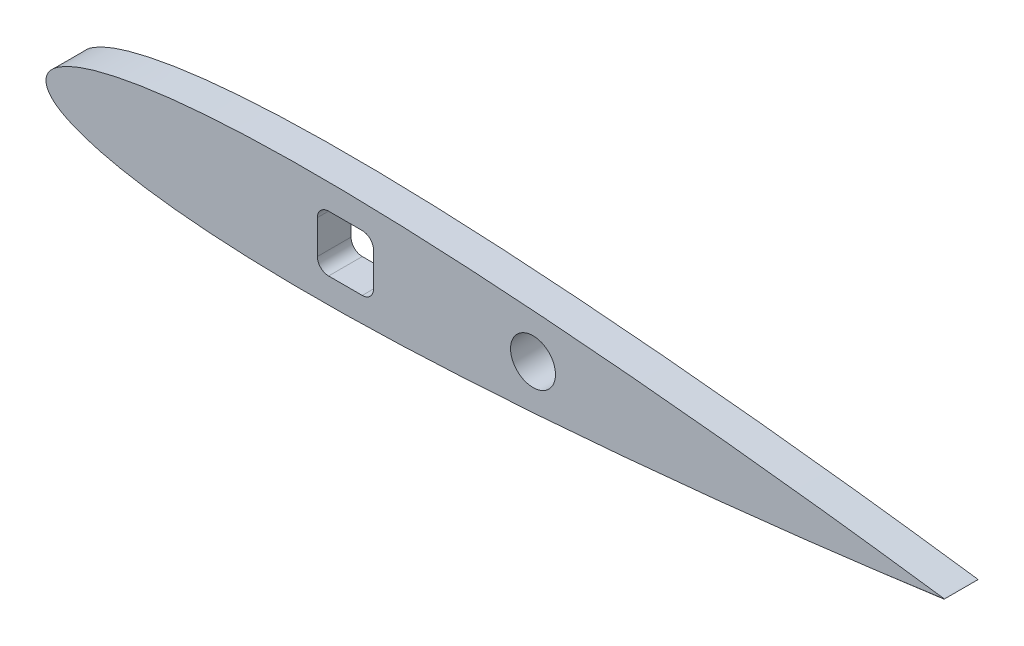
ISO-10303-21;
HEADER;
FILE_DESCRIPTION(('STEP AP214'),'2;1');
FILE_NAME('part.step','',(''),(''),'','','');
FILE_SCHEMA(('AUTOMOTIVE_DESIGN { 1 0 10303 214 1 1 1 1 }'));
ENDSEC;
DATA;
#1=APPLICATION_CONTEXT('core data for automotive mechanical design processes');
#2=APPLICATION_PROTOCOL_DEFINITION('international standard','automotive_design',2000,#1);
#3=PRODUCT_CONTEXT('',#1,'mechanical');
#4=PRODUCT('Part','Part','',(#3));
#5=PRODUCT_RELATED_PRODUCT_CATEGORY('part','',(#4));
#6=PRODUCT_DEFINITION_FORMATION('','',#4);
#7=PRODUCT_DEFINITION_CONTEXT('part definition',#1,'design');
#8=PRODUCT_DEFINITION('design','',#6,#7);
#9=PRODUCT_DEFINITION_SHAPE('','',#8);
#10=(LENGTH_UNIT() NAMED_UNIT(*) SI_UNIT(.MILLI.,.METRE.));
#11=(NAMED_UNIT(*) PLANE_ANGLE_UNIT() SI_UNIT($,.RADIAN.));
#12=(NAMED_UNIT(*) SI_UNIT($,.STERADIAN.) SOLID_ANGLE_UNIT());
#13=UNCERTAINTY_MEASURE_WITH_UNIT(LENGTH_MEASURE(1.E-05),#10,'distance_accuracy_value','');
#14=(GEOMETRIC_REPRESENTATION_CONTEXT(3) GLOBAL_UNCERTAINTY_ASSIGNED_CONTEXT((#13)) GLOBAL_UNIT_ASSIGNED_CONTEXT((#10,
#11,#12)) REPRESENTATION_CONTEXT('',''));
#15=CARTESIAN_POINT('',(0.,0.,0.));
#16=DIRECTION('',(0.,0.,1.));
#17=DIRECTION('',(1.,0.,0.));
#18=AXIS2_PLACEMENT_3D('',#15,#16,#17);
#19=CARTESIAN_POINT('',(0.,0.,6.));
#20=DIRECTION('',(0.,0.,-1.));
#21=DIRECTION('',(-1.,0.,0.));
#22=AXIS2_PLACEMENT_3D('',#19,#20,#21);
#23=PLANE('',#22);
#24=CARTESIAN_POINT('',(86.7452339874848,0.,6.));
#25=DIRECTION('',(0.,0.,-1.));
#26=DIRECTION('',(-1.,0.,0.));
#27=AXIS2_PLACEMENT_3D('',#24,#25,#26);
#28=CIRCLE('',#27,4.00000000000001);
#29=CARTESIAN_POINT('',(82.7452339874848,0.,6.));
#30=VERTEX_POINT('',#29);
#31=EDGE_CURVE('E174',#30,#30,#28,.F.);
#32=ORIENTED_EDGE('',*,*,#31,.F.);
#33=EDGE_LOOP('',(#32));
#34=FACE_BOUND('',#33,.T.);
#35=CARTESIAN_POINT('',(160.,0.,6.));
#36=CARTESIAN_POINT('',(160.,0.0665913442895197,6.));
#37=CARTESIAN_POINT('',(159.008486514791,0.137516412902894,6.));
#38=CARTESIAN_POINT('',(158.424403869658,0.221471317281854,6.));
#39=CARTESIAN_POINT('',(158.144338748107,0.260261487703407,6.));
#40=CARTESIAN_POINT('',(157.684388421284,0.324769540754314,6.));
#41=CARTESIAN_POINT('',(157.039126305256,0.414505738228109,6.));
#42=CARTESIAN_POINT('',(156.213186240448,0.528445908827639,6.));
#43=CARTESIAN_POINT('',(155.207288701819,0.666731734269179,6.));
#44=CARTESIAN_POINT('',(154.024156073932,0.827867529907235,6.));
#45=CARTESIAN_POINT('',(152.666421822384,1.01080968752747,6.));
#46=CARTESIAN_POINT('',(151.137358571736,1.21477584449611,6.));
#47=CARTESIAN_POINT('',(149.44050163396,1.43830165736286,6.));
#48=CARTESIAN_POINT('',(147.579810673162,1.68033718653117,6.));
#49=CARTESIAN_POINT('',(145.559591027277,1.93893961563404,6.));
#50=CARTESIAN_POINT('',(143.384594100147,2.21345495844956,6.));
#51=CARTESIAN_POINT('',(141.059883390887,2.50196263274632,6.));
#52=CARTESIAN_POINT('',(138.59090957664,2.80297044173146,6.));
#53=CARTESIAN_POINT('',(135.98345714493,3.1151347586705,6.));
#54=CARTESIAN_POINT('',(133.243598366923,3.43682445150593,6.));
#55=CARTESIAN_POINT('',(130.377631627294,3.76611244694073,6.));
#56=CARTESIAN_POINT('',(127.392413595854,4.1021577960061,6.));
#57=CARTESIAN_POINT('',(124.294822673243,4.442549864619,6.));
#58=CARTESIAN_POINT('',(121.092191643768,4.78637444268676,6.));
#59=CARTESIAN_POINT('',(117.79187495348,5.13117448589936,6.));
#60=CARTESIAN_POINT('',(114.401652067363,5.47631105428912,6.));
#61=CARTESIAN_POINT('',(110.929399347521,5.81912272354362,6.));
#62=CARTESIAN_POINT('',(107.383281015951,6.15853286209949,6.));
#63=CARTESIAN_POINT('',(103.771531837849,6.49218407854009,6.));
#64=CARTESIAN_POINT('',(100.102577127609,6.81898555162735,6.));
#65=CARTESIAN_POINT('',(96.3850083478131,7.13623567074972,6.));
#66=CARTESIAN_POINT('',(92.6274889078264,7.44251539830241,6.));
#67=CARTESIAN_POINT('',(88.8388421597274,7.7358687859615,6.));
#68=CARTESIAN_POINT('',(85.0278683182967,8.01394094022274,6.));
#69=CARTESIAN_POINT('',(81.2035233400238,8.27498781962035,6.));
#70=CARTESIAN_POINT('',(77.374734607742,8.5169242233947,6.));
#71=CARTESIAN_POINT('',(73.5503645677041,8.73741361137656,6.));
#72=CARTESIAN_POINT('',(69.7394161015396,8.93471234205793,6.));
#73=CARTESIAN_POINT('',(65.9507028394714,9.10666647682192,6.));
#74=CARTESIAN_POINT('',(62.193104455473,9.25136047024652,6.));
#75=CARTESIAN_POINT('',(58.4754531383157,9.36718794509563,6.));
#76=CARTESIAN_POINT('',(54.8064043694087,9.45208857908382,6.));
#77=CARTESIAN_POINT('',(51.1945238394339,9.50456565575243,6.));
#78=CARTESIAN_POINT('',(47.6481593413689,9.52314422677756,6.));
#79=CARTESIAN_POINT('',(44.175663124623,9.50672032249388,6.));
#80=CARTESIAN_POINT('',(40.7851621334313,9.45455551468586,6.));
#81=CARTESIAN_POINT('',(37.4846013989252,9.36507333404973,6.));
#82=CARTESIAN_POINT('',(34.2816159492803,9.23866975749507,6.));
#83=CARTESIAN_POINT('',(31.1836795301445,9.07443654200926,6.));
#84=CARTESIAN_POINT('',(28.198004535038,8.87283401452577,6.));
#85=CARTESIAN_POINT('',(25.3316215482667,8.63390420748747,6.));
#86=CARTESIAN_POINT('',(22.5911947435377,8.35808138151879,6.));
#87=CARTESIAN_POINT('',(19.9830915883747,8.04641185873972,6.));
#88=CARTESIAN_POINT('',(17.5133247824467,7.70016249229624,6.));
#89=CARTESIAN_POINT('',(15.1877125079851,7.31997871948299,6.));
#90=CARTESIAN_POINT('',(13.0115846299075,6.90776063527251,6.));
#91=CARTESIAN_POINT('',(10.9899494711047,6.46505824405837,6.));
#92=CARTESIAN_POINT('',(9.12753175584421,5.99337226158181,6.));
#93=CARTESIAN_POINT('',(7.42844684828317,5.49481576057669,6.));
#94=CARTESIAN_POINT('',(5.89644122559384,4.9710444516897,6.));
#95=CARTESIAN_POINT('',(4.53478197605033,4.42386731692672,6.));
#96=CARTESIAN_POINT('',(3.3461645646699,3.85486286594481,6.));
#97=CARTESIAN_POINT('',(2.33285346312171,3.26521573517184,6.));
#98=CARTESIAN_POINT('',(1.49602863104264,2.65592549182274,6.));
#99=CARTESIAN_POINT('',(0.837307039001217,2.02598988997875,6.));
#100=CARTESIAN_POINT('',(0.358277212466066,1.37362442576094,6.));
#101=CARTESIAN_POINT('',(0.0653976228021366,0.69564041214513,6.));
#102=CARTESIAN_POINT('',(-0.0318775396974388,0.,6.));
#103=CARTESIAN_POINT('',(0.0653976228021371,-0.695640412145142,6.));
#104=CARTESIAN_POINT('',(0.358277212466079,-1.37362442576096,6.));
#105=CARTESIAN_POINT('',(0.837307039001192,-2.02598988997872,6.));
#106=CARTESIAN_POINT('',(1.49602863104265,-2.65592549182275,6.));
#107=CARTESIAN_POINT('',(2.3328534631217,-3.26521573517183,6.));
#108=CARTESIAN_POINT('',(3.34616456466993,-3.85486286594482,6.));
#109=CARTESIAN_POINT('',(4.53478197605032,-4.42386731692672,6.));
#110=CARTESIAN_POINT('',(5.89644122559384,-4.9710444516897,6.));
#111=CARTESIAN_POINT('',(7.42844684828316,-5.49481576057669,6.));
#112=CARTESIAN_POINT('',(9.12753175584424,-5.99337226158182,6.));
#113=CARTESIAN_POINT('',(10.9899494711047,-6.46505824405836,6.));
#114=CARTESIAN_POINT('',(13.0115846299075,-6.90776063527252,6.));
#115=CARTESIAN_POINT('',(15.187712507985,-7.31997871948299,6.));
#116=CARTESIAN_POINT('',(17.5133247824466,-7.70016249229623,6.));
#117=CARTESIAN_POINT('',(19.9830915883747,-8.04641185873973,6.));
#118=CARTESIAN_POINT('',(22.5911947435377,-8.35808138151878,6.));
#119=CARTESIAN_POINT('',(25.3316215482666,-8.63390420748747,6.));
#120=CARTESIAN_POINT('',(28.198004535038,-8.87283401452577,6.));
#121=CARTESIAN_POINT('',(31.1836795301445,-9.07443654200926,6.));
#122=CARTESIAN_POINT('',(34.2816159492803,-9.23866975749507,6.));
#123=CARTESIAN_POINT('',(37.4846013989252,-9.36507333404972,6.));
#124=CARTESIAN_POINT('',(40.7851621334314,-9.45455551468586,6.));
#125=CARTESIAN_POINT('',(44.175663124623,-9.50672032249388,6.));
#126=CARTESIAN_POINT('',(47.6481593413688,-9.52314422677756,6.));
#127=CARTESIAN_POINT('',(51.1945238394339,-9.50456565575243,6.));
#128=CARTESIAN_POINT('',(54.8064043694087,-9.45208857908381,6.));
#129=CARTESIAN_POINT('',(58.4754531383157,-9.36718794509563,6.));
#130=CARTESIAN_POINT('',(62.193104455473,-9.25136047024653,6.));
#131=CARTESIAN_POINT('',(65.9507028394714,-9.10666647682192,6.));
#132=CARTESIAN_POINT('',(69.7394161015397,-8.93471234205793,6.));
#133=CARTESIAN_POINT('',(73.5503645677041,-8.73741361137656,6.));
#134=CARTESIAN_POINT('',(77.3747346077421,-8.5169242233947,6.));
#135=CARTESIAN_POINT('',(81.2035233400238,-8.27498781962035,6.));
#136=CARTESIAN_POINT('',(85.0278683182967,-8.01394094022274,6.));
#137=CARTESIAN_POINT('',(88.8388421597274,-7.7358687859615,6.));
#138=CARTESIAN_POINT('',(92.6274889078264,-7.44251539830241,6.));
#139=CARTESIAN_POINT('',(96.3850083478131,-7.13623567074973,6.));
#140=CARTESIAN_POINT('',(100.10257712761,-6.81898555162735,6.));
#141=CARTESIAN_POINT('',(103.771531837849,-6.49218407854009,6.));
#142=CARTESIAN_POINT('',(107.383281015951,-6.15853286209949,6.));
#143=CARTESIAN_POINT('',(110.929399347521,-5.81912272354363,6.));
#144=CARTESIAN_POINT('',(114.401652067363,-5.47631105428912,6.));
#145=CARTESIAN_POINT('',(117.79187495348,-5.13117448589935,6.));
#146=CARTESIAN_POINT('',(121.092191643768,-4.78637444268676,6.));
#147=CARTESIAN_POINT('',(124.294822673243,-4.442549864619,6.));
#148=CARTESIAN_POINT('',(127.392413595854,-4.1021577960061,6.));
#149=CARTESIAN_POINT('',(130.377631627294,-3.76611244694073,6.));
#150=CARTESIAN_POINT('',(133.243598366923,-3.43682445150593,6.));
#151=CARTESIAN_POINT('',(135.98345714493,-3.1151347586705,6.));
#152=CARTESIAN_POINT('',(138.59090957664,-2.80297044173146,6.));
#153=CARTESIAN_POINT('',(141.059883390887,-2.50196263274633,6.));
#154=CARTESIAN_POINT('',(143.384594100147,-2.21345495844956,6.));
#155=CARTESIAN_POINT('',(145.559591027277,-1.93893961563404,6.));
#156=CARTESIAN_POINT('',(147.579810673162,-1.68033718653117,6.));
#157=CARTESIAN_POINT('',(149.44050163396,-1.43830165736286,6.));
#158=CARTESIAN_POINT('',(151.137358571736,-1.21477584449612,6.));
#159=CARTESIAN_POINT('',(152.666421822384,-1.01080968752747,6.));
#160=CARTESIAN_POINT('',(154.024156073932,-0.827867529907234,6.));
#161=CARTESIAN_POINT('',(155.207288701819,-0.666731734269179,6.));
#162=CARTESIAN_POINT('',(156.213186240449,-0.528445908827641,6.));
#163=CARTESIAN_POINT('',(157.039126305256,-0.414505738228109,6.));
#164=CARTESIAN_POINT('',(157.684388421284,-0.324769540754311,6.));
#165=CARTESIAN_POINT('',(158.144338748106,-0.26026148770341,6.));
#166=CARTESIAN_POINT('',(158.424403869658,-0.221471317281851,6.));
#167=CARTESIAN_POINT('',(159.008486514791,-0.137516412902905,6.));
#168=CARTESIAN_POINT('',(160.,-0.0665913442895195,6.));
#169=CARTESIAN_POINT('',(160.,0.,6.));
#170=B_SPLINE_CURVE_WITH_KNOTS('',3,(#35,#36,#37,#38,#39,#40,#41,#42,#43,#44,#45,#46,#47,#48,
#49,#50,#51,#52,#53,#54,#55,#56,#57,#58,#59,#60,#61,#62,#63,#64,#65,#66,#67,#68,#69,#70,#71,#72,
#73,#74,#75,#76,#77,#78,#79,#80,#81,#82,#83,#84,#85,#86,#87,#88,#89,#90,#91,#92,#93,#94,#95,#96,
#97,#98,#99,#100,#101,#102,#103,#104,#105,#106,#107,#108,#109,#110,#111,#112,#113,#114,#115,
#116,#117,#118,#119,#120,#121,#122,#123,#124,#125,#126,#127,#128,#129,#130,#131,#132,#133,#134,
#135,#136,#137,#138,#139,#140,#141,#142,#143,#144,#145,#146,#147,#148,#149,#150,#151,#152,#153,
#154,#155,#156,#157,#158,#159,#160,#161,#162,#163,#164,#165,#166,#167,#168,#169),.UNSPECIFIED.,
.T.,.F.,(4,1,1,1,1,1,1,1,1,1,1,1,1,1,1,1,1,1,1,1,1,1,1,1,1,1,1,1,1,1,1,1,1,1,1,1,1,1,1,1,1,1,1,
1,1,1,1,1,1,1,1,1,1,1,1,1,1,1,1,1,1,1,1,1,1,1,1,1,1,1,1,1,1,1,1,1,1,1,1,1,1,1,1,1,1,1,1,1,1,1,1,
1,1,1,1,1,1,1,1,1,1,1,1,1,1,1,1,1,1,1,1,1,1,1,1,1,1,1,1,1,1,1,1,1,1,1,1,1,1,1,1,1,4),(0.,
0.00440467877607202,0.0046913326010446,0.00555026340376534,0.00697995981519019,
0.00897636955575151,0.0115348259983267,0.0146494199721657,0.0183124683189223,0.0225153296324683,
0.027247506970764,0.0324978970649823,0.0382539577930807,0.0445020671937163,0.0512268693128557,
0.0584133135428292,0.0660434673993255,0.0740989843347142,0.0825619521789472,0.0914115186687871,
0.100627009155856,0.110186574776246,0.120067575035648,0.130246743106007,0.14070054643734,
0.151404252343734,0.162331841997186,0.173458675482624,0.184758289929072,0.196204075961195,
0.207768617593539,0.219425944952416,0.231147635032322,0.242906359321633,0.254675296387103,
0.266426209651708,0.278132454896869,0.289766476741438,0.301301813942273,0.312711645898873,
0.323969258941208,0.335050049671032,0.345928598532134,0.356580621276815,0.366981996114759,
0.377109775978293,0.386942118775621,0.39645790501707,0.405636644881027,0.414459070100142,
0.422906620434811,0.430962851259574,0.438611617879912,0.445838275003431,0.452630376831667,
0.458976172588127,0.464866300152943,0.47029386795868,0.475254828842886,0.479749124231555,
0.483781005917053,0.487362579763519,0.490515631725567,0.493278565846157,0.495712194393142,
0.497909944007276,0.5,0.502090055992724,0.504287805606858,0.506721434153843,0.509484368274433,
0.512637420236481,0.516218994082947,0.520250875768445,0.524745171157114,0.52970613204132,
0.535133699847057,0.541023827411873,0.547369623168333,0.554161724996569,0.561388382120088,
0.569037148740426,0.577093379565189,0.585540929899858,0.594363355118973,0.60354209498293,
0.613057881224379,0.622890224021707,0.633018003885241,0.643419378723185,0.654071401467866,
0.664949950328968,0.676030741058791,0.687288354101127,0.698698186057727,0.710233523258562,
0.721867545103131,0.733573790348292,0.745324703612897,0.757093640678367,0.768852364967678,
0.780574055047584,0.792231382406461,0.803795924038805,0.815241710070928,0.826541324517376,
0.837668158002814,0.848595747656266,0.85929945356266,0.869753256893993,0.879932424964352,
0.889813425223754,0.899372990844144,0.908588481331213,0.917438047821053,0.925901015665286,
0.933956532600675,0.941586686457171,0.948773130687145,0.955497932806284,0.96174604220692,
0.967502102935018,0.972752493029236,0.977484670367532,0.981687531681078,0.985350580027834,
0.988465174001673,0.991023630444249,0.99302004018481,0.994449736596235,0.995308667398955,
0.995595321223928,1.),.UNSPECIFIED.);
#171=CARTESIAN_POINT('',(160.,0.,6.));
#172=VERTEX_POINT('',#171);
#173=EDGE_CURVE('E11',#172,#172,#170,.T.);
#174=ORIENTED_EDGE('',*,*,#173,.T.);
#175=EDGE_LOOP('',(#174));
#176=FACE_BOUND('',#175,.T.);
#177=CARTESIAN_POINT('',(56.33333333,-3.00000000000001,6.));
#178=DIRECTION('',(0.,0.,1.));
#179=DIRECTION('',(1.,0.,0.));
#180=AXIS2_PLACEMENT_3D('',#177,#178,#179);
#181=CIRCLE('',#180,2.);
#182=CARTESIAN_POINT('',(56.33333333,-5.00000000000001,6.));
#183=VERTEX_POINT('',#182);
#184=CARTESIAN_POINT('',(58.33333333,-3.00000000000001,6.));
#185=VERTEX_POINT('',#184);
#186=EDGE_CURVE('E220',#183,#185,#181,.T.);
#187=ORIENTED_EDGE('',*,*,#186,.F.);
#188=DIRECTION('',(-1.,0.,0.));
#189=VECTOR('',#188,1.);
#190=CARTESIAN_POINT('',(56.33333333,-5.00000000000001,6.));
#191=LINE('',#190,#189);
#192=CARTESIAN_POINT('',(50.33333333,-5.00000000000001,6.));
#193=VERTEX_POINT('',#192);
#194=EDGE_CURVE('E235',#183,#193,#191,.T.);
#195=ORIENTED_EDGE('',*,*,#194,.T.);
#196=CARTESIAN_POINT('',(50.33333333,-3.00000000000001,6.));
#197=DIRECTION('',(0.,0.,-1.));
#198=DIRECTION('',(-1.,0.,0.));
#199=AXIS2_PLACEMENT_3D('',#196,#197,#198);
#200=CIRCLE('',#199,2.);
#201=CARTESIAN_POINT('',(48.33333333,-3.00000000000001,6.));
#202=VERTEX_POINT('',#201);
#203=EDGE_CURVE('E58',#193,#202,#200,.T.);
#204=ORIENTED_EDGE('',*,*,#203,.T.);
#205=DIRECTION('',(0.,1.,0.));
#206=VECTOR('',#205,1.);
#207=CARTESIAN_POINT('',(48.33333333,-3.00000000000001,6.));
#208=LINE('',#207,#206);
#209=CARTESIAN_POINT('',(48.33333333,2.99999999999999,6.));
#210=VERTEX_POINT('',#209);
#211=EDGE_CURVE('E231',#202,#210,#208,.T.);
#212=ORIENTED_EDGE('',*,*,#211,.T.);
#213=CARTESIAN_POINT('',(50.33333333,2.99999999999999,6.));
#214=DIRECTION('',(0.,0.,1.));
#215=DIRECTION('',(1.,0.,0.));
#216=AXIS2_PLACEMENT_3D('',#213,#214,#215);
#217=CIRCLE('',#216,2.);
#218=CARTESIAN_POINT('',(50.33333333,4.99999999999999,6.));
#219=VERTEX_POINT('',#218);
#220=EDGE_CURVE('E229',#219,#210,#217,.T.);
#221=ORIENTED_EDGE('',*,*,#220,.F.);
#222=DIRECTION('',(-1.,0.,0.));
#223=VECTOR('',#222,1.);
#224=CARTESIAN_POINT('',(56.33333333,4.99999999999999,6.));
#225=LINE('',#224,#223);
#226=CARTESIAN_POINT('',(56.33333333,4.99999999999999,6.));
#227=VERTEX_POINT('',#226);
#228=EDGE_CURVE('E227',#227,#219,#225,.T.);
#229=ORIENTED_EDGE('',*,*,#228,.F.);
#230=CARTESIAN_POINT('',(56.33333333,2.99999999999999,6.));
#231=DIRECTION('',(0.,0.,1.));
#232=DIRECTION('',(1.,0.,0.));
#233=AXIS2_PLACEMENT_3D('',#230,#231,#232);
#234=CIRCLE('',#233,2.);
#235=CARTESIAN_POINT('',(58.33333333,2.99999999999999,6.));
#236=VERTEX_POINT('',#235);
#237=EDGE_CURVE('E225',#236,#227,#234,.T.);
#238=ORIENTED_EDGE('',*,*,#237,.F.);
#239=DIRECTION('',(0.,1.,0.));
#240=VECTOR('',#239,1.);
#241=CARTESIAN_POINT('',(58.33333333,-3.00000000000001,6.));
#242=LINE('',#241,#240);
#243=EDGE_CURVE('E222',#185,#236,#242,.T.);
#244=ORIENTED_EDGE('',*,*,#243,.F.);
#245=EDGE_LOOP('',(#187,#195,#204,#212,#221,#229,#238,#244));
#246=FACE_BOUND('',#245,.T.);
#247=ADVANCED_FACE('F33',(#34,#176,#246),#23,.F.);
#248=CARTESIAN_POINT('',(0.,0.,0.));
#249=DIRECTION('',(0.,0.,-1.));
#250=DIRECTION('',(-1.,0.,0.));
#251=AXIS2_PLACEMENT_3D('',#248,#249,#250);
#252=PLANE('',#251);
#253=CARTESIAN_POINT('',(86.7452339874848,0.,0.));
#254=DIRECTION('',(0.,0.,1.));
#255=DIRECTION('',(1.,0.,0.));
#256=AXIS2_PLACEMENT_3D('',#253,#254,#255);
#257=CIRCLE('',#256,4.00000000000001);
#258=CARTESIAN_POINT('',(90.7452339874848,0.,0.));
#259=VERTEX_POINT('',#258);
#260=EDGE_CURVE('E482',#259,#259,#257,.T.);
#261=ORIENTED_EDGE('',*,*,#260,.T.);
#262=EDGE_LOOP('',(#261));
#263=FACE_BOUND('',#262,.T.);
#264=CARTESIAN_POINT('',(13.,-2.,0.));
#265=DIRECTION('',(0.,0.,-1.));
#266=DIRECTION('',(-1.,0.,0.));
#267=AXIS2_PLACEMENT_3D('',#264,#265,#266);
#268=CIRCLE('',#267,2.);
#269=CARTESIAN_POINT('',(13.,-4.,0.));
#270=VERTEX_POINT('',#269);
#271=CARTESIAN_POINT('',(11.,-1.99999999999999,0.));
#272=VERTEX_POINT('',#271);
#273=EDGE_CURVE('E50',#270,#272,#268,.T.);
#274=ORIENTED_EDGE('',*,*,#273,.F.);
#275=DIRECTION('',(1.,0.,0.));
#276=VECTOR('',#275,1.);
#277=CARTESIAN_POINT('',(13.,-4.,0.));
#278=LINE('',#277,#276);
#279=CARTESIAN_POINT('',(17.,-4.,0.));
#280=VERTEX_POINT('',#279);
#281=EDGE_CURVE('E168',#270,#280,#278,.T.);
#282=ORIENTED_EDGE('',*,*,#281,.T.);
#283=CARTESIAN_POINT('',(17.,-2.,0.));
#284=DIRECTION('',(0.,0.,1.));
#285=DIRECTION('',(1.,0.,0.));
#286=AXIS2_PLACEMENT_3D('',#283,#284,#285);
#287=CIRCLE('',#286,2.);
#288=CARTESIAN_POINT('',(19.,-1.99999999999999,0.));
#289=VERTEX_POINT('',#288);
#290=EDGE_CURVE('E171',#280,#289,#287,.T.);
#291=ORIENTED_EDGE('',*,*,#290,.T.);
#292=DIRECTION('',(0.,1.,0.));
#293=VECTOR('',#292,1.);
#294=CARTESIAN_POINT('',(19.,-1.99999999999999,0.));
#295=LINE('',#294,#293);
#296=CARTESIAN_POINT('',(19.,1.99999999999999,0.));
#297=VERTEX_POINT('',#296);
#298=EDGE_CURVE('E201',#289,#297,#295,.T.);
#299=ORIENTED_EDGE('',*,*,#298,.T.);
#300=CARTESIAN_POINT('',(17.,2.,0.));
#301=DIRECTION('',(0.,0.,-1.));
#302=DIRECTION('',(-1.,0.,0.));
#303=AXIS2_PLACEMENT_3D('',#300,#301,#302);
#304=CIRCLE('',#303,2.);
#305=CARTESIAN_POINT('',(17.,4.,0.));
#306=VERTEX_POINT('',#305);
#307=EDGE_CURVE('E198',#306,#297,#304,.T.);
#308=ORIENTED_EDGE('',*,*,#307,.F.);
#309=DIRECTION('',(1.,0.,0.));
#310=VECTOR('',#309,1.);
#311=CARTESIAN_POINT('',(13.,4.,0.));
#312=LINE('',#311,#310);
#313=CARTESIAN_POINT('',(13.,4.,0.));
#314=VERTEX_POINT('',#313);
#315=EDGE_CURVE('E195',#314,#306,#312,.T.);
#316=ORIENTED_EDGE('',*,*,#315,.F.);
#317=CARTESIAN_POINT('',(13.,2.,0.));
#318=DIRECTION('',(0.,0.,-1.));
#319=DIRECTION('',(-1.,0.,0.));
#320=AXIS2_PLACEMENT_3D('',#317,#318,#319);
#321=CIRCLE('',#320,2.);
#322=CARTESIAN_POINT('',(11.,1.99999999999999,0.));
#323=VERTEX_POINT('',#322);
#324=EDGE_CURVE('E192',#323,#314,#321,.T.);
#325=ORIENTED_EDGE('',*,*,#324,.F.);
#326=DIRECTION('',(0.,1.,0.));
#327=VECTOR('',#326,1.);
#328=CARTESIAN_POINT('',(11.,-1.99999999999999,0.));
#329=LINE('',#328,#327);
#330=EDGE_CURVE('E190',#272,#323,#329,.T.);
#331=ORIENTED_EDGE('',*,*,#330,.F.);
#332=EDGE_LOOP('',(#274,#282,#291,#299,#308,#316,#325,#331));
#333=FACE_BOUND('',#332,.T.);
#334=CARTESIAN_POINT('',(160.,0.,0.));
#335=CARTESIAN_POINT('',(160.,0.0665913442895197,0.));
#336=CARTESIAN_POINT('',(159.008486514791,0.137516412902894,0.));
#337=CARTESIAN_POINT('',(158.424403869658,0.221471317281854,0.));
#338=CARTESIAN_POINT('',(158.144338748107,0.260261487703407,0.));
#339=CARTESIAN_POINT('',(157.684388421284,0.324769540754314,0.));
#340=CARTESIAN_POINT('',(157.039126305256,0.414505738228109,0.));
#341=CARTESIAN_POINT('',(156.213186240448,0.528445908827639,0.));
#342=CARTESIAN_POINT('',(155.207288701819,0.666731734269179,0.));
#343=CARTESIAN_POINT('',(154.024156073932,0.827867529907235,0.));
#344=CARTESIAN_POINT('',(152.666421822384,1.01080968752747,0.));
#345=CARTESIAN_POINT('',(151.137358571736,1.21477584449611,0.));
#346=CARTESIAN_POINT('',(149.44050163396,1.43830165736286,0.));
#347=CARTESIAN_POINT('',(147.579810673162,1.68033718653117,0.));
#348=CARTESIAN_POINT('',(145.559591027277,1.93893961563404,0.));
#349=CARTESIAN_POINT('',(143.384594100147,2.21345495844956,0.));
#350=CARTESIAN_POINT('',(141.059883390887,2.50196263274632,0.));
#351=CARTESIAN_POINT('',(138.59090957664,2.80297044173146,0.));
#352=CARTESIAN_POINT('',(135.98345714493,3.1151347586705,0.));
#353=CARTESIAN_POINT('',(133.243598366923,3.43682445150593,0.));
#354=CARTESIAN_POINT('',(130.377631627294,3.76611244694073,0.));
#355=CARTESIAN_POINT('',(127.392413595854,4.1021577960061,0.));
#356=CARTESIAN_POINT('',(124.294822673243,4.442549864619,0.));
#357=CARTESIAN_POINT('',(121.092191643768,4.78637444268676,0.));
#358=CARTESIAN_POINT('',(117.79187495348,5.13117448589936,0.));
#359=CARTESIAN_POINT('',(114.401652067363,5.47631105428912,0.));
#360=CARTESIAN_POINT('',(110.929399347521,5.81912272354362,0.));
#361=CARTESIAN_POINT('',(107.383281015951,6.15853286209949,0.));
#362=CARTESIAN_POINT('',(103.771531837849,6.49218407854009,0.));
#363=CARTESIAN_POINT('',(100.102577127609,6.81898555162735,0.));
#364=CARTESIAN_POINT('',(96.3850083478131,7.13623567074972,0.));
#365=CARTESIAN_POINT('',(92.6274889078264,7.44251539830241,0.));
#366=CARTESIAN_POINT('',(88.8388421597274,7.7358687859615,0.));
#367=CARTESIAN_POINT('',(85.0278683182967,8.01394094022274,0.));
#368=CARTESIAN_POINT('',(81.2035233400238,8.27498781962035,0.));
#369=CARTESIAN_POINT('',(77.374734607742,8.5169242233947,0.));
#370=CARTESIAN_POINT('',(73.5503645677041,8.73741361137656,0.));
#371=CARTESIAN_POINT('',(69.7394161015396,8.93471234205793,0.));
#372=CARTESIAN_POINT('',(65.9507028394714,9.10666647682192,0.));
#373=CARTESIAN_POINT('',(62.193104455473,9.25136047024652,0.));
#374=CARTESIAN_POINT('',(58.4754531383157,9.36718794509563,0.));
#375=CARTESIAN_POINT('',(54.8064043694087,9.45208857908382,0.));
#376=CARTESIAN_POINT('',(51.1945238394339,9.50456565575243,0.));
#377=CARTESIAN_POINT('',(47.6481593413689,9.52314422677756,0.));
#378=CARTESIAN_POINT('',(44.175663124623,9.50672032249388,0.));
#379=CARTESIAN_POINT('',(40.7851621334313,9.45455551468586,0.));
#380=CARTESIAN_POINT('',(37.4846013989252,9.36507333404973,0.));
#381=CARTESIAN_POINT('',(34.2816159492803,9.23866975749507,0.));
#382=CARTESIAN_POINT('',(31.1836795301445,9.07443654200926,0.));
#383=CARTESIAN_POINT('',(28.198004535038,8.87283401452577,0.));
#384=CARTESIAN_POINT('',(25.3316215482667,8.63390420748747,0.));
#385=CARTESIAN_POINT('',(22.5911947435377,8.35808138151879,0.));
#386=CARTESIAN_POINT('',(19.9830915883747,8.04641185873972,0.));
#387=CARTESIAN_POINT('',(17.5133247824467,7.70016249229624,0.));
#388=CARTESIAN_POINT('',(15.1877125079851,7.31997871948299,0.));
#389=CARTESIAN_POINT('',(13.0115846299075,6.90776063527251,0.));
#390=CARTESIAN_POINT('',(10.9899494711047,6.46505824405837,0.));
#391=CARTESIAN_POINT('',(9.12753175584421,5.99337226158181,0.));
#392=CARTESIAN_POINT('',(7.42844684828317,5.49481576057669,0.));
#393=CARTESIAN_POINT('',(5.89644122559384,4.9710444516897,0.));
#394=CARTESIAN_POINT('',(4.53478197605033,4.42386731692672,0.));
#395=CARTESIAN_POINT('',(3.3461645646699,3.85486286594481,0.));
#396=CARTESIAN_POINT('',(2.33285346312171,3.26521573517184,0.));
#397=CARTESIAN_POINT('',(1.49602863104264,2.65592549182274,0.));
#398=CARTESIAN_POINT('',(0.837307039001217,2.02598988997875,0.));
#399=CARTESIAN_POINT('',(0.358277212466066,1.37362442576094,0.));
#400=CARTESIAN_POINT('',(0.0653976228021366,0.69564041214513,0.));
#401=CARTESIAN_POINT('',(-0.0318775396974388,0.,0.));
#402=CARTESIAN_POINT('',(0.0653976228021371,-0.695640412145142,0.));
#403=CARTESIAN_POINT('',(0.358277212466079,-1.37362442576096,0.));
#404=CARTESIAN_POINT('',(0.837307039001192,-2.02598988997872,0.));
#405=CARTESIAN_POINT('',(1.49602863104265,-2.65592549182275,0.));
#406=CARTESIAN_POINT('',(2.3328534631217,-3.26521573517183,0.));
#407=CARTESIAN_POINT('',(3.34616456466993,-3.85486286594482,0.));
#408=CARTESIAN_POINT('',(4.53478197605032,-4.42386731692672,0.));
#409=CARTESIAN_POINT('',(5.89644122559384,-4.9710444516897,0.));
#410=CARTESIAN_POINT('',(7.42844684828316,-5.49481576057669,0.));
#411=CARTESIAN_POINT('',(9.12753175584424,-5.99337226158182,0.));
#412=CARTESIAN_POINT('',(10.9899494711047,-6.46505824405836,0.));
#413=CARTESIAN_POINT('',(13.0115846299075,-6.90776063527252,0.));
#414=CARTESIAN_POINT('',(15.187712507985,-7.31997871948299,0.));
#415=CARTESIAN_POINT('',(17.5133247824466,-7.70016249229623,0.));
#416=CARTESIAN_POINT('',(19.9830915883747,-8.04641185873973,0.));
#417=CARTESIAN_POINT('',(22.5911947435377,-8.35808138151878,0.));
#418=CARTESIAN_POINT('',(25.3316215482666,-8.63390420748747,0.));
#419=CARTESIAN_POINT('',(28.198004535038,-8.87283401452577,0.));
#420=CARTESIAN_POINT('',(31.1836795301445,-9.07443654200926,0.));
#421=CARTESIAN_POINT('',(34.2816159492803,-9.23866975749507,0.));
#422=CARTESIAN_POINT('',(37.4846013989252,-9.36507333404972,0.));
#423=CARTESIAN_POINT('',(40.7851621334314,-9.45455551468586,0.));
#424=CARTESIAN_POINT('',(44.175663124623,-9.50672032249388,0.));
#425=CARTESIAN_POINT('',(47.6481593413688,-9.52314422677756,0.));
#426=CARTESIAN_POINT('',(51.1945238394339,-9.50456565575243,0.));
#427=CARTESIAN_POINT('',(54.8064043694087,-9.45208857908381,0.));
#428=CARTESIAN_POINT('',(58.4754531383157,-9.36718794509563,0.));
#429=CARTESIAN_POINT('',(62.193104455473,-9.25136047024653,0.));
#430=CARTESIAN_POINT('',(65.9507028394714,-9.10666647682192,0.));
#431=CARTESIAN_POINT('',(69.7394161015397,-8.93471234205793,0.));
#432=CARTESIAN_POINT('',(73.5503645677041,-8.73741361137656,0.));
#433=CARTESIAN_POINT('',(77.3747346077421,-8.5169242233947,0.));
#434=CARTESIAN_POINT('',(81.2035233400238,-8.27498781962035,0.));
#435=CARTESIAN_POINT('',(85.0278683182967,-8.01394094022274,0.));
#436=CARTESIAN_POINT('',(88.8388421597274,-7.7358687859615,0.));
#437=CARTESIAN_POINT('',(92.6274889078264,-7.44251539830241,0.));
#438=CARTESIAN_POINT('',(96.3850083478131,-7.13623567074973,0.));
#439=CARTESIAN_POINT('',(100.10257712761,-6.81898555162735,0.));
#440=CARTESIAN_POINT('',(103.771531837849,-6.49218407854009,0.));
#441=CARTESIAN_POINT('',(107.383281015951,-6.15853286209949,0.));
#442=CARTESIAN_POINT('',(110.929399347521,-5.81912272354363,0.));
#443=CARTESIAN_POINT('',(114.401652067363,-5.47631105428912,0.));
#444=CARTESIAN_POINT('',(117.79187495348,-5.13117448589935,0.));
#445=CARTESIAN_POINT('',(121.092191643768,-4.78637444268676,0.));
#446=CARTESIAN_POINT('',(124.294822673243,-4.442549864619,0.));
#447=CARTESIAN_POINT('',(127.392413595854,-4.1021577960061,0.));
#448=CARTESIAN_POINT('',(130.377631627294,-3.76611244694073,0.));
#449=CARTESIAN_POINT('',(133.243598366923,-3.43682445150593,0.));
#450=CARTESIAN_POINT('',(135.98345714493,-3.1151347586705,0.));
#451=CARTESIAN_POINT('',(138.59090957664,-2.80297044173146,0.));
#452=CARTESIAN_POINT('',(141.059883390887,-2.50196263274633,0.));
#453=CARTESIAN_POINT('',(143.384594100147,-2.21345495844956,0.));
#454=CARTESIAN_POINT('',(145.559591027277,-1.93893961563404,0.));
#455=CARTESIAN_POINT('',(147.579810673162,-1.68033718653117,0.));
#456=CARTESIAN_POINT('',(149.44050163396,-1.43830165736286,0.));
#457=CARTESIAN_POINT('',(151.137358571736,-1.21477584449612,0.));
#458=CARTESIAN_POINT('',(152.666421822384,-1.01080968752747,0.));
#459=CARTESIAN_POINT('',(154.024156073932,-0.827867529907234,0.));
#460=CARTESIAN_POINT('',(155.207288701819,-0.666731734269179,0.));
#461=CARTESIAN_POINT('',(156.213186240449,-0.528445908827641,0.));
#462=CARTESIAN_POINT('',(157.039126305256,-0.414505738228109,0.));
#463=CARTESIAN_POINT('',(157.684388421284,-0.324769540754311,0.));
#464=CARTESIAN_POINT('',(158.144338748106,-0.26026148770341,0.));
#465=CARTESIAN_POINT('',(158.424403869658,-0.221471317281851,0.));
#466=CARTESIAN_POINT('',(159.008486514791,-0.137516412902905,0.));
#467=CARTESIAN_POINT('',(160.,-0.0665913442895195,0.));
#468=CARTESIAN_POINT('',(160.,0.,0.));
#469=B_SPLINE_CURVE_WITH_KNOTS('',3,(#334,#335,#336,#337,#338,#339,#340,#341,#342,#343,#344,
#345,#346,#347,#348,#349,#350,#351,#352,#353,#354,#355,#356,#357,#358,#359,#360,#361,#362,#363,
#364,#365,#366,#367,#368,#369,#370,#371,#372,#373,#374,#375,#376,#377,#378,#379,#380,#381,#382,
#383,#384,#385,#386,#387,#388,#389,#390,#391,#392,#393,#394,#395,#396,#397,#398,#399,#400,#401,
#402,#403,#404,#405,#406,#407,#408,#409,#410,#411,#412,#413,#414,#415,#416,#417,#418,#419,#420,
#421,#422,#423,#424,#425,#426,#427,#428,#429,#430,#431,#432,#433,#434,#435,#436,#437,#438,#439,
#440,#441,#442,#443,#444,#445,#446,#447,#448,#449,#450,#451,#452,#453,#454,#455,#456,#457,#458,
#459,#460,#461,#462,#463,#464,#465,#466,#467,#468),.UNSPECIFIED.,.T.,.F.,(4,1,1,1,1,1,1,1,1,1,1,
1,1,1,1,1,1,1,1,1,1,1,1,1,1,1,1,1,1,1,1,1,1,1,1,1,1,1,1,1,1,1,1,1,1,1,1,1,1,1,1,1,1,1,1,1,1,1,1,
1,1,1,1,1,1,1,1,1,1,1,1,1,1,1,1,1,1,1,1,1,1,1,1,1,1,1,1,1,1,1,1,1,1,1,1,1,1,1,1,1,1,1,1,1,1,1,1,
1,1,1,1,1,1,1,1,1,1,1,1,1,1,1,1,1,1,1,1,1,1,1,1,1,4),(0.,0.00440467877607202,0.0046913326010446,
0.00555026340376534,0.00697995981519019,0.00897636955575151,0.0115348259983267,
0.0146494199721657,0.0183124683189223,0.0225153296324683,0.027247506970764,0.0324978970649823,
0.0382539577930807,0.0445020671937163,0.0512268693128557,0.0584133135428292,0.0660434673993255,
0.0740989843347142,0.0825619521789472,0.0914115186687871,0.100627009155856,0.110186574776246,
0.120067575035648,0.130246743106007,0.14070054643734,0.151404252343734,0.162331841997186,
0.173458675482624,0.184758289929072,0.196204075961195,0.207768617593539,0.219425944952416,
0.231147635032322,0.242906359321633,0.254675296387103,0.266426209651708,0.278132454896869,
0.289766476741438,0.301301813942273,0.312711645898873,0.323969258941208,0.335050049671032,
0.345928598532134,0.356580621276815,0.366981996114759,0.377109775978293,0.386942118775621,
0.39645790501707,0.405636644881027,0.414459070100142,0.422906620434811,0.430962851259574,
0.438611617879912,0.445838275003431,0.452630376831667,0.458976172588127,0.464866300152943,
0.47029386795868,0.475254828842886,0.479749124231555,0.483781005917053,0.487362579763519,
0.490515631725567,0.493278565846157,0.495712194393142,0.497909944007276,0.5,0.502090055992724,
0.504287805606858,0.506721434153843,0.509484368274433,0.512637420236481,0.516218994082947,
0.520250875768445,0.524745171157114,0.52970613204132,0.535133699847057,0.541023827411873,
0.547369623168333,0.554161724996569,0.561388382120088,0.569037148740426,0.577093379565189,
0.585540929899858,0.594363355118973,0.60354209498293,0.613057881224379,0.622890224021707,
0.633018003885241,0.643419378723185,0.654071401467866,0.664949950328968,0.676030741058791,
0.687288354101127,0.698698186057727,0.710233523258562,0.721867545103131,0.733573790348292,
0.745324703612897,0.757093640678367,0.768852364967678,0.780574055047584,0.792231382406461,
0.803795924038805,0.815241710070928,0.826541324517376,0.837668158002814,0.848595747656266,
0.85929945356266,0.869753256893993,0.879932424964352,0.889813425223754,0.899372990844144,
0.908588481331213,0.917438047821053,0.925901015665286,0.933956532600675,0.941586686457171,
0.948773130687145,0.955497932806284,0.96174604220692,0.967502102935018,0.972752493029236,
0.977484670367532,0.981687531681078,0.985350580027834,0.988465174001673,0.991023630444249,
0.99302004018481,0.994449736596235,0.995308667398955,0.995595321223928,1.),.UNSPECIFIED.);
#470=CARTESIAN_POINT('',(160.,0.,0.));
#471=VERTEX_POINT('',#470);
#472=EDGE_CURVE('E38',#471,#471,#469,.T.);
#473=ORIENTED_EDGE('',*,*,#472,.F.);
#474=EDGE_LOOP('',(#473));
#475=FACE_BOUND('',#474,.T.);
#476=DIRECTION('',(-1.,0.,0.));
#477=VECTOR('',#476,1.);
#478=CARTESIAN_POINT('',(56.33333333,-5.00000000000001,0.));
#479=LINE('',#478,#477);
#480=CARTESIAN_POINT('',(56.33333333,-5.00000000000001,0.));
#481=VERTEX_POINT('',#480);
#482=CARTESIAN_POINT('',(50.33333333,-5.00000000000001,0.));
#483=VERTEX_POINT('',#482);
#484=EDGE_CURVE('E223',#481,#483,#479,.T.);
#485=ORIENTED_EDGE('',*,*,#484,.F.);
#486=CARTESIAN_POINT('',(56.33333333,-3.00000000000001,0.));
#487=DIRECTION('',(0.,0.,1.));
#488=DIRECTION('',(1.,0.,0.));
#489=AXIS2_PLACEMENT_3D('',#486,#487,#488);
#490=CIRCLE('',#489,2.);
#491=CARTESIAN_POINT('',(58.33333333,-3.00000000000001,0.));
#492=VERTEX_POINT('',#491);
#493=EDGE_CURVE('E208',#481,#492,#490,.T.);
#494=ORIENTED_EDGE('',*,*,#493,.T.);
#495=DIRECTION('',(0.,1.,0.));
#496=VECTOR('',#495,1.);
#497=CARTESIAN_POINT('',(58.33333333,-3.00000000000001,0.));
#498=LINE('',#497,#496);
#499=CARTESIAN_POINT('',(58.33333333,2.99999999999999,0.));
#500=VERTEX_POINT('',#499);
#501=EDGE_CURVE('E241',#492,#500,#498,.T.);
#502=ORIENTED_EDGE('',*,*,#501,.T.);
#503=CARTESIAN_POINT('',(56.33333333,2.99999999999999,0.));
#504=DIRECTION('',(0.,0.,1.));
#505=DIRECTION('',(1.,0.,0.));
#506=AXIS2_PLACEMENT_3D('',#503,#504,#505);
#507=CIRCLE('',#506,2.);
#508=CARTESIAN_POINT('',(56.33333333,4.99999999999999,0.));
#509=VERTEX_POINT('',#508);
#510=EDGE_CURVE('E244',#500,#509,#507,.T.);
#511=ORIENTED_EDGE('',*,*,#510,.T.);
#512=DIRECTION('',(-1.,0.,0.));
#513=VECTOR('',#512,1.);
#514=CARTESIAN_POINT('',(56.33333333,4.99999999999999,0.));
#515=LINE('',#514,#513);
#516=CARTESIAN_POINT('',(50.33333333,4.99999999999999,0.));
#517=VERTEX_POINT('',#516);
#518=EDGE_CURVE('E247',#509,#517,#515,.T.);
#519=ORIENTED_EDGE('',*,*,#518,.T.);
#520=CARTESIAN_POINT('',(50.33333333,2.99999999999999,0.));
#521=DIRECTION('',(0.,0.,1.));
#522=DIRECTION('',(1.,0.,0.));
#523=AXIS2_PLACEMENT_3D('',#520,#521,#522);
#524=CIRCLE('',#523,2.);
#525=CARTESIAN_POINT('',(48.33333333,2.99999999999999,0.));
#526=VERTEX_POINT('',#525);
#527=EDGE_CURVE('E250',#517,#526,#524,.T.);
#528=ORIENTED_EDGE('',*,*,#527,.T.);
#529=DIRECTION('',(0.,1.,0.));
#530=VECTOR('',#529,1.);
#531=CARTESIAN_POINT('',(48.33333333,-3.00000000000001,0.));
#532=LINE('',#531,#530);
#533=CARTESIAN_POINT('',(48.33333333,-3.00000000000001,0.));
#534=VERTEX_POINT('',#533);
#535=EDGE_CURVE('E253',#534,#526,#532,.T.);
#536=ORIENTED_EDGE('',*,*,#535,.F.);
#537=CARTESIAN_POINT('',(50.33333333,-3.00000000000001,0.));
#538=DIRECTION('',(0.,0.,-1.));
#539=DIRECTION('',(-1.,0.,0.));
#540=AXIS2_PLACEMENT_3D('',#537,#538,#539);
#541=CIRCLE('',#540,2.);
#542=EDGE_CURVE('E256',#483,#534,#541,.T.);
#543=ORIENTED_EDGE('',*,*,#542,.F.);
#544=EDGE_LOOP('',(#485,#494,#502,#511,#519,#528,#536,#543));
#545=FACE_BOUND('',#544,.T.);
#546=ADVANCED_FACE('F289',(#263,#333,#475,#545),#252,.T.);
#547=DIRECTION('',(0.,0.,-1.));
#548=VECTOR('',#547,1.);
#549=SURFACE_OF_LINEAR_EXTRUSION('',#170,#548);
#550=ORIENTED_EDGE('',*,*,#173,.F.);
#551=EDGE_LOOP('',(#550));
#552=FACE_BOUND('',#551,.T.);
#553=ORIENTED_EDGE('',*,*,#472,.T.);
#554=EDGE_LOOP('',(#553));
#555=FACE_BOUND('',#554,.T.);
#556=ADVANCED_FACE('F35',(#552,#555),#549,.F.);
#557=CARTESIAN_POINT('',(56.33333333,-3.00000000000001,6.));
#558=DIRECTION('',(0.,0.,-1.));
#559=DIRECTION('',(-1.,0.,0.));
#560=AXIS2_PLACEMENT_3D('',#557,#558,#559);
#561=CYLINDRICAL_SURFACE('',#560,2.);
#562=ORIENTED_EDGE('',*,*,#493,.F.);
#563=DIRECTION('',(0.,0.,-1.));
#564=VECTOR('',#563,1.);
#565=CARTESIAN_POINT('',(56.33333333,-5.00000000000001,6.));
#566=LINE('',#565,#564);
#567=EDGE_CURVE('E238',#183,#481,#566,.T.);
#568=ORIENTED_EDGE('',*,*,#567,.F.);
#569=ORIENTED_EDGE('',*,*,#186,.T.);
#570=DIRECTION('',(0.,0.,-1.));
#571=VECTOR('',#570,1.);
#572=CARTESIAN_POINT('',(58.33333333,-3.00000000000001,6.));
#573=LINE('',#572,#571);
#574=EDGE_CURVE('E275',#185,#492,#573,.T.);
#575=ORIENTED_EDGE('',*,*,#574,.T.);
#576=EDGE_LOOP('',(#562,#568,#569,#575));
#577=FACE_BOUND('',#576,.T.);
#578=ADVANCED_FACE('F300',(#577),#561,.F.);
#579=CARTESIAN_POINT('',(58.33333333,-3.00000000000001,6.));
#580=DIRECTION('',(-1.,0.,0.));
#581=DIRECTION('',(0.,0.,1.));
#582=AXIS2_PLACEMENT_3D('',#579,#580,#581);
#583=PLANE('',#582);
#584=ORIENTED_EDGE('',*,*,#501,.F.);
#585=ORIENTED_EDGE('',*,*,#574,.F.);
#586=ORIENTED_EDGE('',*,*,#243,.T.);
#587=DIRECTION('',(0.,0.,-1.));
#588=VECTOR('',#587,1.);
#589=CARTESIAN_POINT('',(58.33333333,2.99999999999999,6.));
#590=LINE('',#589,#588);
#591=EDGE_CURVE('E273',#236,#500,#590,.T.);
#592=ORIENTED_EDGE('',*,*,#591,.T.);
#593=EDGE_LOOP('',(#584,#585,#586,#592));
#594=FACE_BOUND('',#593,.T.);
#595=ADVANCED_FACE('F304',(#594),#583,.T.);
#596=CARTESIAN_POINT('',(56.33333333,2.99999999999999,6.));
#597=DIRECTION('',(0.,0.,-1.));
#598=DIRECTION('',(-1.,0.,0.));
#599=AXIS2_PLACEMENT_3D('',#596,#597,#598);
#600=CYLINDRICAL_SURFACE('',#599,2.);
#601=ORIENTED_EDGE('',*,*,#510,.F.);
#602=ORIENTED_EDGE('',*,*,#591,.F.);
#603=ORIENTED_EDGE('',*,*,#237,.T.);
#604=DIRECTION('',(0.,0.,-1.));
#605=VECTOR('',#604,1.);
#606=CARTESIAN_POINT('',(56.33333333,4.99999999999999,6.));
#607=LINE('',#606,#605);
#608=EDGE_CURVE('E271',#227,#509,#607,.T.);
#609=ORIENTED_EDGE('',*,*,#608,.T.);
#610=EDGE_LOOP('',(#601,#602,#603,#609));
#611=FACE_BOUND('',#610,.T.);
#612=ADVANCED_FACE('F312',(#611),#600,.F.);
#613=CARTESIAN_POINT('',(56.33333333,4.99999999999999,6.));
#614=DIRECTION('',(0.,-1.,0.));
#615=DIRECTION('',(0.,0.,-1.));
#616=AXIS2_PLACEMENT_3D('',#613,#614,#615);
#617=PLANE('',#616);
#618=ORIENTED_EDGE('',*,*,#518,.F.);
#619=ORIENTED_EDGE('',*,*,#608,.F.);
#620=ORIENTED_EDGE('',*,*,#228,.T.);
#621=DIRECTION('',(0.,0.,-1.));
#622=VECTOR('',#621,1.);
#623=CARTESIAN_POINT('',(50.33333333,4.99999999999999,6.));
#624=LINE('',#623,#622);
#625=EDGE_CURVE('E269',#219,#517,#624,.T.);
#626=ORIENTED_EDGE('',*,*,#625,.T.);
#627=EDGE_LOOP('',(#618,#619,#620,#626));
#628=FACE_BOUND('',#627,.T.);
#629=ADVANCED_FACE('F315',(#628),#617,.T.);
#630=CARTESIAN_POINT('',(50.33333333,2.99999999999999,6.));
#631=DIRECTION('',(0.,0.,-1.));
#632=DIRECTION('',(-1.,0.,0.));
#633=AXIS2_PLACEMENT_3D('',#630,#631,#632);
#634=CYLINDRICAL_SURFACE('',#633,2.);
#635=ORIENTED_EDGE('',*,*,#527,.F.);
#636=ORIENTED_EDGE('',*,*,#625,.F.);
#637=ORIENTED_EDGE('',*,*,#220,.T.);
#638=DIRECTION('',(0.,0.,-1.));
#639=VECTOR('',#638,1.);
#640=CARTESIAN_POINT('',(48.33333333,2.99999999999999,6.));
#641=LINE('',#640,#639);
#642=EDGE_CURVE('E267',#210,#526,#641,.T.);
#643=ORIENTED_EDGE('',*,*,#642,.T.);
#644=EDGE_LOOP('',(#635,#636,#637,#643));
#645=FACE_BOUND('',#644,.T.);
#646=ADVANCED_FACE('F319',(#645),#634,.F.);
#647=CARTESIAN_POINT('',(48.33333333,-3.00000000000001,6.));
#648=DIRECTION('',(-1.,0.,0.));
#649=DIRECTION('',(0.,0.,1.));
#650=AXIS2_PLACEMENT_3D('',#647,#648,#649);
#651=PLANE('',#650);
#652=ORIENTED_EDGE('',*,*,#535,.T.);
#653=ORIENTED_EDGE('',*,*,#642,.F.);
#654=ORIENTED_EDGE('',*,*,#211,.F.);
#655=DIRECTION('',(0.,0.,-1.));
#656=VECTOR('',#655,1.);
#657=CARTESIAN_POINT('',(48.33333333,-3.00000000000001,6.));
#658=LINE('',#657,#656);
#659=EDGE_CURVE('E265',#202,#534,#658,.T.);
#660=ORIENTED_EDGE('',*,*,#659,.T.);
#661=EDGE_LOOP('',(#652,#653,#654,#660));
#662=FACE_BOUND('',#661,.T.);
#663=ADVANCED_FACE('F323',(#662),#651,.F.);
#664=CARTESIAN_POINT('',(50.33333333,-3.00000000000001,6.));
#665=DIRECTION('',(0.,0.,-1.));
#666=DIRECTION('',(-1.,0.,0.));
#667=AXIS2_PLACEMENT_3D('',#664,#665,#666);
#668=CYLINDRICAL_SURFACE('',#667,2.);
#669=ORIENTED_EDGE('',*,*,#542,.T.);
#670=ORIENTED_EDGE('',*,*,#659,.F.);
#671=ORIENTED_EDGE('',*,*,#203,.F.);
#672=DIRECTION('',(0.,0.,-1.));
#673=VECTOR('',#672,1.);
#674=CARTESIAN_POINT('',(50.33333333,-5.00000000000001,6.));
#675=LINE('',#674,#673);
#676=EDGE_CURVE('E263',#193,#483,#675,.T.);
#677=ORIENTED_EDGE('',*,*,#676,.T.);
#678=EDGE_LOOP('',(#669,#670,#671,#677));
#679=FACE_BOUND('',#678,.T.);
#680=ADVANCED_FACE('F324',(#679),#668,.F.);
#681=CARTESIAN_POINT('',(56.33333333,-5.00000000000001,6.));
#682=DIRECTION('',(0.,-1.,0.));
#683=DIRECTION('',(1.,0.,0.));
#684=AXIS2_PLACEMENT_3D('',#681,#682,#683);
#685=PLANE('',#684);
#686=ORIENTED_EDGE('',*,*,#484,.T.);
#687=ORIENTED_EDGE('',*,*,#676,.F.);
#688=ORIENTED_EDGE('',*,*,#194,.F.);
#689=ORIENTED_EDGE('',*,*,#567,.T.);
#690=EDGE_LOOP('',(#686,#687,#688,#689));
#691=FACE_BOUND('',#690,.T.);
#692=ADVANCED_FACE('F297',(#691),#685,.F.);
#693=CARTESIAN_POINT('',(13.,-2.,2.));
#694=DIRECTION('',(0.,0.,-1.));
#695=DIRECTION('',(-1.,0.,0.));
#696=AXIS2_PLACEMENT_3D('',#693,#694,#695);
#697=CYLINDRICAL_SURFACE('',#696,2.);
#698=ORIENTED_EDGE('',*,*,#273,.T.);
#699=DIRECTION('',(0.,0.,-1.));
#700=VECTOR('',#699,1.);
#701=CARTESIAN_POINT('',(11.,-1.99999999999999,2.));
#702=LINE('',#701,#700);
#703=CARTESIAN_POINT('',(11.,-1.99999999999999,2.));
#704=VERTEX_POINT('',#703);
#705=EDGE_CURVE('E146',#704,#272,#702,.T.);
#706=ORIENTED_EDGE('',*,*,#705,.F.);
#707=CARTESIAN_POINT('',(13.,-2.,2.));
#708=DIRECTION('',(0.,0.,-1.));
#709=DIRECTION('',(-1.,0.,0.));
#710=AXIS2_PLACEMENT_3D('',#707,#708,#709);
#711=CIRCLE('',#710,2.);
#712=CARTESIAN_POINT('',(13.,-4.,2.));
#713=VERTEX_POINT('',#712);
#714=EDGE_CURVE('E150',#713,#704,#711,.T.);
#715=ORIENTED_EDGE('',*,*,#714,.F.);
#716=DIRECTION('',(0.,0.,-1.));
#717=VECTOR('',#716,1.);
#718=CARTESIAN_POINT('',(13.,-4.,2.));
#719=LINE('',#718,#717);
#720=EDGE_CURVE('E206',#713,#270,#719,.T.);
#721=ORIENTED_EDGE('',*,*,#720,.T.);
#722=EDGE_LOOP('',(#698,#706,#715,#721));
#723=FACE_BOUND('',#722,.T.);
#724=ADVANCED_FACE('F148',(#723),#697,.F.);
#725=CARTESIAN_POINT('',(13.,-4.,2.));
#726=DIRECTION('',(0.,1.,0.));
#727=DIRECTION('',(0.,0.,1.));
#728=AXIS2_PLACEMENT_3D('',#725,#726,#727);
#729=PLANE('',#728);
#730=ORIENTED_EDGE('',*,*,#281,.F.);
#731=ORIENTED_EDGE('',*,*,#720,.F.);
#732=DIRECTION('',(1.,0.,0.));
#733=VECTOR('',#732,1.);
#734=CARTESIAN_POINT('',(13.,-4.,2.));
#735=LINE('',#734,#733);
#736=CARTESIAN_POINT('',(17.,-4.,2.));
#737=VERTEX_POINT('',#736);
#738=EDGE_CURVE('E155',#713,#737,#735,.T.);
#739=ORIENTED_EDGE('',*,*,#738,.T.);
#740=DIRECTION('',(0.,0.,-1.));
#741=VECTOR('',#740,1.);
#742=CARTESIAN_POINT('',(17.,-4.,2.));
#743=LINE('',#742,#741);
#744=EDGE_CURVE('E209',#737,#280,#743,.T.);
#745=ORIENTED_EDGE('',*,*,#744,.T.);
#746=EDGE_LOOP('',(#730,#731,#739,#745));
#747=FACE_BOUND('',#746,.T.);
#748=ADVANCED_FACE('F377',(#747),#729,.T.);
#749=CARTESIAN_POINT('',(17.,-2.,2.));
#750=DIRECTION('',(0.,0.,-1.));
#751=DIRECTION('',(-1.,0.,0.));
#752=AXIS2_PLACEMENT_3D('',#749,#750,#751);
#753=CYLINDRICAL_SURFACE('',#752,2.);
#754=ORIENTED_EDGE('',*,*,#290,.F.);
#755=ORIENTED_EDGE('',*,*,#744,.F.);
#756=CARTESIAN_POINT('',(17.,-2.,2.));
#757=DIRECTION('',(0.,0.,1.));
#758=DIRECTION('',(1.,0.,0.));
#759=AXIS2_PLACEMENT_3D('',#756,#757,#758);
#760=CIRCLE('',#759,2.);
#761=CARTESIAN_POINT('',(19.,-1.99999999999999,2.));
#762=VERTEX_POINT('',#761);
#763=EDGE_CURVE('E186',#737,#762,#760,.T.);
#764=ORIENTED_EDGE('',*,*,#763,.T.);
#765=DIRECTION('',(0.,0.,-1.));
#766=VECTOR('',#765,1.);
#767=CARTESIAN_POINT('',(19.,-1.99999999999999,2.));
#768=LINE('',#767,#766);
#769=EDGE_CURVE('E211',#762,#289,#768,.T.);
#770=ORIENTED_EDGE('',*,*,#769,.T.);
#771=EDGE_LOOP('',(#754,#755,#764,#770));
#772=FACE_BOUND('',#771,.T.);
#773=ADVANCED_FACE('F386',(#772),#753,.F.);
#774=CARTESIAN_POINT('',(19.,-1.99999999999999,2.));
#775=DIRECTION('',(-1.,0.,0.));
#776=DIRECTION('',(0.,0.,1.));
#777=AXIS2_PLACEMENT_3D('',#774,#775,#776);
#778=PLANE('',#777);
#779=ORIENTED_EDGE('',*,*,#298,.F.);
#780=ORIENTED_EDGE('',*,*,#769,.F.);
#781=DIRECTION('',(0.,1.,0.));
#782=VECTOR('',#781,1.);
#783=CARTESIAN_POINT('',(19.,-1.99999999999999,2.));
#784=LINE('',#783,#782);
#785=CARTESIAN_POINT('',(19.,1.99999999999999,2.));
#786=VERTEX_POINT('',#785);
#787=EDGE_CURVE('E184',#762,#786,#784,.T.);
#788=ORIENTED_EDGE('',*,*,#787,.T.);
#789=DIRECTION('',(0.,0.,-1.));
#790=VECTOR('',#789,1.);
#791=CARTESIAN_POINT('',(19.,1.99999999999999,2.));
#792=LINE('',#791,#790);
#793=EDGE_CURVE('E213',#786,#297,#792,.T.);
#794=ORIENTED_EDGE('',*,*,#793,.T.);
#795=EDGE_LOOP('',(#779,#780,#788,#794));
#796=FACE_BOUND('',#795,.T.);
#797=ADVANCED_FACE('F396',(#796),#778,.T.);
#798=CARTESIAN_POINT('',(17.,2.,2.));
#799=DIRECTION('',(0.,0.,-1.));
#800=DIRECTION('',(-1.,0.,0.));
#801=AXIS2_PLACEMENT_3D('',#798,#799,#800);
#802=CYLINDRICAL_SURFACE('',#801,2.);
#803=ORIENTED_EDGE('',*,*,#307,.T.);
#804=ORIENTED_EDGE('',*,*,#793,.F.);
#805=CARTESIAN_POINT('',(17.,2.,2.));
#806=DIRECTION('',(0.,0.,-1.));
#807=DIRECTION('',(-1.,0.,0.));
#808=AXIS2_PLACEMENT_3D('',#805,#806,#807);
#809=CIRCLE('',#808,2.);
#810=CARTESIAN_POINT('',(17.,4.,2.));
#811=VERTEX_POINT('',#810);
#812=EDGE_CURVE('E181',#811,#786,#809,.T.);
#813=ORIENTED_EDGE('',*,*,#812,.F.);
#814=DIRECTION('',(0.,0.,-1.));
#815=VECTOR('',#814,1.);
#816=CARTESIAN_POINT('',(17.,4.,2.));
#817=LINE('',#816,#815);
#818=EDGE_CURVE('E215',#811,#306,#817,.T.);
#819=ORIENTED_EDGE('',*,*,#818,.T.);
#820=EDGE_LOOP('',(#803,#804,#813,#819));
#821=FACE_BOUND('',#820,.T.);
#822=ADVANCED_FACE('F406',(#821),#802,.F.);
#823=CARTESIAN_POINT('',(13.,4.,2.));
#824=DIRECTION('',(0.,1.,0.));
#825=DIRECTION('',(0.,0.,1.));
#826=AXIS2_PLACEMENT_3D('',#823,#824,#825);
#827=PLANE('',#826);
#828=ORIENTED_EDGE('',*,*,#315,.T.);
#829=ORIENTED_EDGE('',*,*,#818,.F.);
#830=DIRECTION('',(1.,0.,0.));
#831=VECTOR('',#830,1.);
#832=CARTESIAN_POINT('',(13.,4.,2.));
#833=LINE('',#832,#831);
#834=CARTESIAN_POINT('',(13.,4.,2.));
#835=VERTEX_POINT('',#834);
#836=EDGE_CURVE('E178',#835,#811,#833,.T.);
#837=ORIENTED_EDGE('',*,*,#836,.F.);
#838=DIRECTION('',(0.,0.,-1.));
#839=VECTOR('',#838,1.);
#840=CARTESIAN_POINT('',(13.,4.,2.));
#841=LINE('',#840,#839);
#842=EDGE_CURVE('E217',#835,#314,#841,.T.);
#843=ORIENTED_EDGE('',*,*,#842,.T.);
#844=EDGE_LOOP('',(#828,#829,#837,#843));
#845=FACE_BOUND('',#844,.T.);
#846=ADVANCED_FACE('F416',(#845),#827,.F.);
#847=CARTESIAN_POINT('',(13.,2.,2.));
#848=DIRECTION('',(0.,0.,-1.));
#849=DIRECTION('',(-1.,0.,0.));
#850=AXIS2_PLACEMENT_3D('',#847,#848,#849);
#851=CYLINDRICAL_SURFACE('',#850,2.);
#852=ORIENTED_EDGE('',*,*,#324,.T.);
#853=ORIENTED_EDGE('',*,*,#842,.F.);
#854=CARTESIAN_POINT('',(13.,2.,2.));
#855=DIRECTION('',(0.,0.,-1.));
#856=DIRECTION('',(-1.,0.,0.));
#857=AXIS2_PLACEMENT_3D('',#854,#855,#856);
#858=CIRCLE('',#857,2.);
#859=CARTESIAN_POINT('',(11.,1.99999999999999,2.));
#860=VERTEX_POINT('',#859);
#861=EDGE_CURVE('E163',#860,#835,#858,.T.);
#862=ORIENTED_EDGE('',*,*,#861,.F.);
#863=DIRECTION('',(0.,0.,-1.));
#864=VECTOR('',#863,1.);
#865=CARTESIAN_POINT('',(11.,1.99999999999999,2.));
#866=LINE('',#865,#864);
#867=EDGE_CURVE('E154',#860,#323,#866,.T.);
#868=ORIENTED_EDGE('',*,*,#867,.T.);
#869=EDGE_LOOP('',(#852,#853,#862,#868));
#870=FACE_BOUND('',#869,.T.);
#871=ADVANCED_FACE('F426',(#870),#851,.F.);
#872=CARTESIAN_POINT('',(11.,-1.99999999999999,2.));
#873=DIRECTION('',(-1.,0.,0.));
#874=DIRECTION('',(0.,0.,1.));
#875=AXIS2_PLACEMENT_3D('',#872,#873,#874);
#876=PLANE('',#875);
#877=ORIENTED_EDGE('',*,*,#330,.T.);
#878=ORIENTED_EDGE('',*,*,#867,.F.);
#879=DIRECTION('',(0.,1.,0.));
#880=VECTOR('',#879,1.);
#881=CARTESIAN_POINT('',(11.,-1.99999999999999,2.));
#882=LINE('',#881,#880);
#883=EDGE_CURVE('E158',#704,#860,#882,.T.);
#884=ORIENTED_EDGE('',*,*,#883,.F.);
#885=ORIENTED_EDGE('',*,*,#705,.T.);
#886=EDGE_LOOP('',(#877,#878,#884,#885));
#887=FACE_BOUND('',#886,.T.);
#888=ADVANCED_FACE('F159',(#887),#876,.F.);
#889=CARTESIAN_POINT('',(13.,-2.,2.));
#890=DIRECTION('',(0.,0.,-1.));
#891=DIRECTION('',(-1.,0.,0.));
#892=AXIS2_PLACEMENT_3D('',#889,#890,#891);
#893=PLANE('',#892);
#894=ORIENTED_EDGE('',*,*,#714,.T.);
#895=ORIENTED_EDGE('',*,*,#883,.T.);
#896=ORIENTED_EDGE('',*,*,#861,.T.);
#897=ORIENTED_EDGE('',*,*,#836,.T.);
#898=ORIENTED_EDGE('',*,*,#812,.T.);
#899=ORIENTED_EDGE('',*,*,#787,.F.);
#900=ORIENTED_EDGE('',*,*,#763,.F.);
#901=ORIENTED_EDGE('',*,*,#738,.F.);
#902=EDGE_LOOP('',(#894,#895,#896,#897,#898,#899,#900,#901));
#903=FACE_BOUND('',#902,.T.);
#904=ADVANCED_FACE('F166',(#903),#893,.T.);
#905=CARTESIAN_POINT('',(86.7452339874848,0.,10.));
#906=DIRECTION('',(0.,0.,-1.));
#907=DIRECTION('',(-1.,0.,0.));
#908=AXIS2_PLACEMENT_3D('',#905,#906,#907);
#909=CYLINDRICAL_SURFACE('',#908,4.00000000000001);
#910=ORIENTED_EDGE('',*,*,#260,.F.);
#911=EDGE_LOOP('',(#910));
#912=FACE_BOUND('',#911,.T.);
#913=ORIENTED_EDGE('',*,*,#31,.T.);
#914=EDGE_LOOP('',(#913));
#915=FACE_BOUND('',#914,.T.);
#916=ADVANCED_FACE('F452',(#912,#915),#909,.F.);
#917=CLOSED_SHELL('',(#247,#546,#556,#578,#595,#612,#629,#646,#663,#680,#692,#724,#748,#773,
#797,#822,#846,#871,#888,#904,#916));
#918=MANIFOLD_SOLID_BREP('B2',#917);
#919=ADVANCED_BREP_SHAPE_REPRESENTATION('',(#18,#918),#14);
#920=SHAPE_DEFINITION_REPRESENTATION(#9,#919);
ENDSEC;
END-ISO-10303-21;
